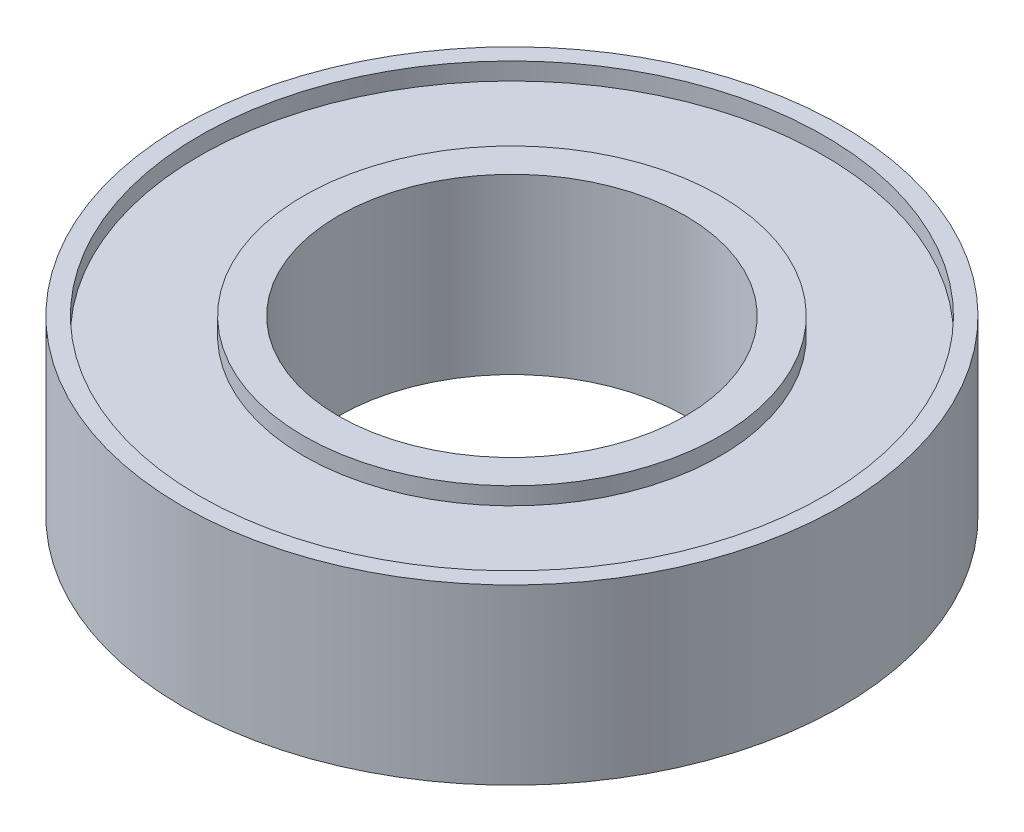
ISO-10303-21;
HEADER;
FILE_DESCRIPTION(('STEP AP214'),'2;1');
FILE_NAME('part.step','',(''),(''),'','','');
FILE_SCHEMA(('AUTOMOTIVE_DESIGN { 1 0 10303 214 1 1 1 1 }'));
ENDSEC;
DATA;
#1=APPLICATION_CONTEXT('core data for automotive mechanical design processes');
#2=APPLICATION_PROTOCOL_DEFINITION('international standard','automotive_design',2000,#1);
#3=PRODUCT_CONTEXT('',#1,'mechanical');
#4=PRODUCT('Part','Part','',(#3));
#5=PRODUCT_RELATED_PRODUCT_CATEGORY('part','',(#4));
#6=PRODUCT_DEFINITION_FORMATION('','',#4);
#7=PRODUCT_DEFINITION_CONTEXT('part definition',#1,'design');
#8=PRODUCT_DEFINITION('design','',#6,#7);
#9=PRODUCT_DEFINITION_SHAPE('','',#8);
#10=(LENGTH_UNIT() NAMED_UNIT(*) SI_UNIT(.MILLI.,.METRE.));
#11=(NAMED_UNIT(*) PLANE_ANGLE_UNIT() SI_UNIT($,.RADIAN.));
#12=(NAMED_UNIT(*) SI_UNIT($,.STERADIAN.) SOLID_ANGLE_UNIT());
#13=UNCERTAINTY_MEASURE_WITH_UNIT(LENGTH_MEASURE(1.E-05),#10,'distance_accuracy_value','');
#14=(GEOMETRIC_REPRESENTATION_CONTEXT(3) GLOBAL_UNCERTAINTY_ASSIGNED_CONTEXT((#13)) GLOBAL_UNIT_ASSIGNED_CONTEXT((#10,
#11,#12)) REPRESENTATION_CONTEXT('',''));
#15=CARTESIAN_POINT('',(0.,0.,0.));
#16=DIRECTION('',(0.,0.,1.));
#17=DIRECTION('',(1.,0.,0.));
#18=AXIS2_PLACEMENT_3D('',#15,#16,#17);
#19=CARTESIAN_POINT('',(0.,0.,0.));
#20=DIRECTION('',(0.,1.,0.));
#21=DIRECTION('',(0.,0.,1.));
#22=AXIS2_PLACEMENT_3D('',#19,#20,#21);
#23=PLANE('',#22);
#24=CARTESIAN_POINT('',(0.,0.,0.));
#25=DIRECTION('',(0.,1.,0.));
#26=DIRECTION('',(0.,0.,1.));
#27=AXIS2_PLACEMENT_3D('',#24,#25,#26);
#28=CIRCLE('',#27,5.);
#29=CARTESIAN_POINT('',(0.,0.,5.));
#30=VERTEX_POINT('',#29);
#31=EDGE_CURVE('E44',#30,#30,#28,.T.);
#32=ORIENTED_EDGE('',*,*,#31,.T.);
#33=EDGE_LOOP('',(#32));
#34=FACE_BOUND('',#33,.T.);
#35=CARTESIAN_POINT('',(0.,0.,0.));
#36=DIRECTION('',(0.,-1.,0.));
#37=DIRECTION('',(0.,0.,-1.));
#38=AXIS2_PLACEMENT_3D('',#35,#36,#37);
#39=CIRCLE('',#38,6.);
#40=CARTESIAN_POINT('',(0.,0.,-6.));
#41=VERTEX_POINT('',#40);
#42=EDGE_CURVE('E68',#41,#41,#39,.T.);
#43=ORIENTED_EDGE('',*,*,#42,.T.);
#44=EDGE_LOOP('',(#43));
#45=FACE_BOUND('',#44,.T.);
#46=ADVANCED_FACE('F31',(#34,#45),#23,.F.);
#47=CARTESIAN_POINT('',(0.,5.,0.));
#48=DIRECTION('',(0.,1.,0.));
#49=DIRECTION('',(0.,0.,1.));
#50=AXIS2_PLACEMENT_3D('',#47,#48,#49);
#51=PLANE('',#50);
#52=CARTESIAN_POINT('',(0.,5.,0.));
#53=DIRECTION('',(0.,1.,0.));
#54=DIRECTION('',(0.,0.,1.));
#55=AXIS2_PLACEMENT_3D('',#52,#53,#54);
#56=CIRCLE('',#55,5.);
#57=CARTESIAN_POINT('',(0.,5.,5.));
#58=VERTEX_POINT('',#57);
#59=EDGE_CURVE('E42',#58,#58,#56,.T.);
#60=ORIENTED_EDGE('',*,*,#59,.F.);
#61=EDGE_LOOP('',(#60));
#62=FACE_BOUND('',#61,.T.);
#63=CARTESIAN_POINT('',(0.,5.,0.));
#64=DIRECTION('',(0.,1.,0.));
#65=DIRECTION('',(0.,0.,1.));
#66=AXIS2_PLACEMENT_3D('',#63,#64,#65);
#67=CIRCLE('',#66,6.);
#68=CARTESIAN_POINT('',(0.,5.,6.));
#69=VERTEX_POINT('',#68);
#70=EDGE_CURVE('E56',#69,#69,#67,.T.);
#71=ORIENTED_EDGE('',*,*,#70,.T.);
#72=EDGE_LOOP('',(#71));
#73=FACE_BOUND('',#72,.T.);
#74=ADVANCED_FACE('F106',(#62,#73),#51,.T.);
#75=CARTESIAN_POINT('',(0.,5.,0.));
#76=DIRECTION('',(0.,1.,0.));
#77=DIRECTION('',(0.,0.,1.));
#78=AXIS2_PLACEMENT_3D('',#75,#76,#77);
#79=CIRCLE('',#78,9.);
#80=CARTESIAN_POINT('',(0.,5.,9.));
#81=VERTEX_POINT('',#80);
#82=EDGE_CURVE('E50',#81,#81,#79,.T.);
#83=ORIENTED_EDGE('',*,*,#82,.F.);
#84=EDGE_LOOP('',(#83));
#85=FACE_BOUND('',#84,.T.);
#86=CARTESIAN_POINT('',(0.,5.,0.));
#87=DIRECTION('',(0.,1.,0.));
#88=DIRECTION('',(0.,0.,1.));
#89=AXIS2_PLACEMENT_3D('',#86,#87,#88);
#90=CIRCLE('',#89,9.5);
#91=CARTESIAN_POINT('',(0.,5.,9.5));
#92=VERTEX_POINT('',#91);
#93=EDGE_CURVE('E10',#92,#92,#90,.T.);
#94=ORIENTED_EDGE('',*,*,#93,.T.);
#95=EDGE_LOOP('',(#94));
#96=FACE_BOUND('',#95,.T.);
#97=ADVANCED_FACE('F93',(#85,#96),#51,.T.);
#98=CARTESIAN_POINT('',(0.,0.,0.));
#99=DIRECTION('',(0.,-1.,0.));
#100=DIRECTION('',(0.,0.,-1.));
#101=AXIS2_PLACEMENT_3D('',#98,#99,#100);
#102=CIRCLE('',#101,9.);
#103=CARTESIAN_POINT('',(0.,0.,-9.));
#104=VERTEX_POINT('',#103);
#105=EDGE_CURVE('E62',#104,#104,#102,.T.);
#106=ORIENTED_EDGE('',*,*,#105,.F.);
#107=EDGE_LOOP('',(#106));
#108=FACE_BOUND('',#107,.T.);
#109=CARTESIAN_POINT('',(0.,0.,0.));
#110=DIRECTION('',(0.,1.,0.));
#111=DIRECTION('',(0.,0.,1.));
#112=AXIS2_PLACEMENT_3D('',#109,#110,#111);
#113=CIRCLE('',#112,9.5);
#114=CARTESIAN_POINT('',(0.,0.,9.5));
#115=VERTEX_POINT('',#114);
#116=EDGE_CURVE('E35',#115,#115,#113,.T.);
#117=ORIENTED_EDGE('',*,*,#116,.F.);
#118=EDGE_LOOP('',(#117));
#119=FACE_BOUND('',#118,.T.);
#120=ADVANCED_FACE('F90',(#108,#119),#23,.F.);
#121=CARTESIAN_POINT('',(0.,5.,0.));
#122=DIRECTION('',(0.,-1.,0.));
#123=DIRECTION('',(0.,0.,-1.));
#124=AXIS2_PLACEMENT_3D('',#121,#122,#123);
#125=CYLINDRICAL_SURFACE('',#124,9.5);
#126=ORIENTED_EDGE('',*,*,#93,.F.);
#127=EDGE_LOOP('',(#126));
#128=FACE_BOUND('',#127,.T.);
#129=ORIENTED_EDGE('',*,*,#116,.T.);
#130=EDGE_LOOP('',(#129));
#131=FACE_BOUND('',#130,.T.);
#132=ADVANCED_FACE('F33',(#128,#131),#125,.T.);
#133=CARTESIAN_POINT('',(0.,5.,0.));
#134=DIRECTION('',(0.,-1.,0.));
#135=DIRECTION('',(0.,0.,-1.));
#136=AXIS2_PLACEMENT_3D('',#133,#134,#135);
#137=CYLINDRICAL_SURFACE('',#136,5.);
#138=ORIENTED_EDGE('',*,*,#59,.T.);
#139=EDGE_LOOP('',(#138));
#140=FACE_BOUND('',#139,.T.);
#141=ORIENTED_EDGE('',*,*,#31,.F.);
#142=EDGE_LOOP('',(#141));
#143=FACE_BOUND('',#142,.T.);
#144=ADVANCED_FACE('F97',(#140,#143),#137,.F.);
#145=CARTESIAN_POINT('',(0.,4.5,0.));
#146=DIRECTION('',(0.,1.,0.));
#147=DIRECTION('',(0.,0.,1.));
#148=AXIS2_PLACEMENT_3D('',#145,#146,#147);
#149=CYLINDRICAL_SURFACE('',#148,9.);
#150=CARTESIAN_POINT('',(0.,4.5,0.));
#151=DIRECTION('',(0.,1.,0.));
#152=DIRECTION('',(0.,0.,1.));
#153=AXIS2_PLACEMENT_3D('',#150,#151,#152);
#154=CIRCLE('',#153,9.);
#155=CARTESIAN_POINT('',(0.,4.5,9.));
#156=VERTEX_POINT('',#155);
#157=EDGE_CURVE('E47',#156,#156,#154,.T.);
#158=ORIENTED_EDGE('',*,*,#157,.F.);
#159=EDGE_LOOP('',(#158));
#160=FACE_BOUND('',#159,.T.);
#161=ORIENTED_EDGE('',*,*,#82,.T.);
#162=EDGE_LOOP('',(#161));
#163=FACE_BOUND('',#162,.T.);
#164=ADVANCED_FACE('F102',(#160,#163),#149,.F.);
#165=CARTESIAN_POINT('',(0.,4.5,0.));
#166=DIRECTION('',(0.,1.,0.));
#167=DIRECTION('',(0.,0.,1.));
#168=AXIS2_PLACEMENT_3D('',#165,#166,#167);
#169=PLANE('',#168);
#170=CARTESIAN_POINT('',(0.,4.5,0.));
#171=DIRECTION('',(0.,1.,0.));
#172=DIRECTION('',(0.,0.,1.));
#173=AXIS2_PLACEMENT_3D('',#170,#171,#172);
#174=CIRCLE('',#173,6.);
#175=CARTESIAN_POINT('',(0.,4.5,6.));
#176=VERTEX_POINT('',#175);
#177=EDGE_CURVE('E53',#176,#176,#174,.T.);
#178=ORIENTED_EDGE('',*,*,#177,.F.);
#179=EDGE_LOOP('',(#178));
#180=FACE_BOUND('',#179,.T.);
#181=ORIENTED_EDGE('',*,*,#157,.T.);
#182=EDGE_LOOP('',(#181));
#183=FACE_BOUND('',#182,.T.);
#184=ADVANCED_FACE('F119',(#180,#183),#169,.T.);
#185=CARTESIAN_POINT('',(0.,4.5,0.));
#186=DIRECTION('',(0.,1.,0.));
#187=DIRECTION('',(0.,0.,1.));
#188=AXIS2_PLACEMENT_3D('',#185,#186,#187);
#189=CYLINDRICAL_SURFACE('',#188,6.);
#190=ORIENTED_EDGE('',*,*,#177,.T.);
#191=EDGE_LOOP('',(#190));
#192=FACE_BOUND('',#191,.T.);
#193=ORIENTED_EDGE('',*,*,#70,.F.);
#194=EDGE_LOOP('',(#193));
#195=FACE_BOUND('',#194,.T.);
#196=ADVANCED_FACE('F86',(#192,#195),#189,.T.);
#197=CARTESIAN_POINT('',(0.,0.5,0.));
#198=DIRECTION('',(0.,-1.,0.));
#199=DIRECTION('',(0.,0.,-1.));
#200=AXIS2_PLACEMENT_3D('',#197,#198,#199);
#201=CYLINDRICAL_SURFACE('',#200,9.);
#202=CARTESIAN_POINT('',(0.,0.5,0.));
#203=DIRECTION('',(0.,-1.,0.));
#204=DIRECTION('',(0.,0.,-1.));
#205=AXIS2_PLACEMENT_3D('',#202,#203,#204);
#206=CIRCLE('',#205,9.);
#207=CARTESIAN_POINT('',(0.,0.5,-9.));
#208=VERTEX_POINT('',#207);
#209=EDGE_CURVE('E59',#208,#208,#206,.T.);
#210=ORIENTED_EDGE('',*,*,#209,.F.);
#211=EDGE_LOOP('',(#210));
#212=FACE_BOUND('',#211,.T.);
#213=ORIENTED_EDGE('',*,*,#105,.T.);
#214=EDGE_LOOP('',(#213));
#215=FACE_BOUND('',#214,.T.);
#216=ADVANCED_FACE('F80',(#212,#215),#201,.F.);
#217=CARTESIAN_POINT('',(0.,0.5,0.));
#218=DIRECTION('',(0.,-1.,0.));
#219=DIRECTION('',(0.,0.,-1.));
#220=AXIS2_PLACEMENT_3D('',#217,#218,#219);
#221=PLANE('',#220);
#222=CARTESIAN_POINT('',(0.,0.5,0.));
#223=DIRECTION('',(0.,-1.,0.));
#224=DIRECTION('',(0.,0.,-1.));
#225=AXIS2_PLACEMENT_3D('',#222,#223,#224);
#226=CIRCLE('',#225,6.);
#227=CARTESIAN_POINT('',(0.,0.5,-6.));
#228=VERTEX_POINT('',#227);
#229=EDGE_CURVE('E65',#228,#228,#226,.T.);
#230=ORIENTED_EDGE('',*,*,#229,.F.);
#231=EDGE_LOOP('',(#230));
#232=FACE_BOUND('',#231,.T.);
#233=ORIENTED_EDGE('',*,*,#209,.T.);
#234=EDGE_LOOP('',(#233));
#235=FACE_BOUND('',#234,.T.);
#236=ADVANCED_FACE('F77',(#232,#235),#221,.T.);
#237=CARTESIAN_POINT('',(0.,0.5,0.));
#238=DIRECTION('',(0.,-1.,0.));
#239=DIRECTION('',(0.,0.,-1.));
#240=AXIS2_PLACEMENT_3D('',#237,#238,#239);
#241=CYLINDRICAL_SURFACE('',#240,6.);
#242=ORIENTED_EDGE('',*,*,#229,.T.);
#243=EDGE_LOOP('',(#242));
#244=FACE_BOUND('',#243,.T.);
#245=ORIENTED_EDGE('',*,*,#42,.F.);
#246=EDGE_LOOP('',(#245));
#247=FACE_BOUND('',#246,.T.);
#248=ADVANCED_FACE('F74',(#244,#247),#241,.T.);
#249=CLOSED_SHELL('',(#46,#74,#97,#120,#132,#144,#164,#184,#196,#216,#236,#248));
#250=MANIFOLD_SOLID_BREP('B2',#249);
#251=ADVANCED_BREP_SHAPE_REPRESENTATION('',(#18,#250),#14);
#252=SHAPE_DEFINITION_REPRESENTATION(#9,#251);
ENDSEC;
END-ISO-10303-21;
